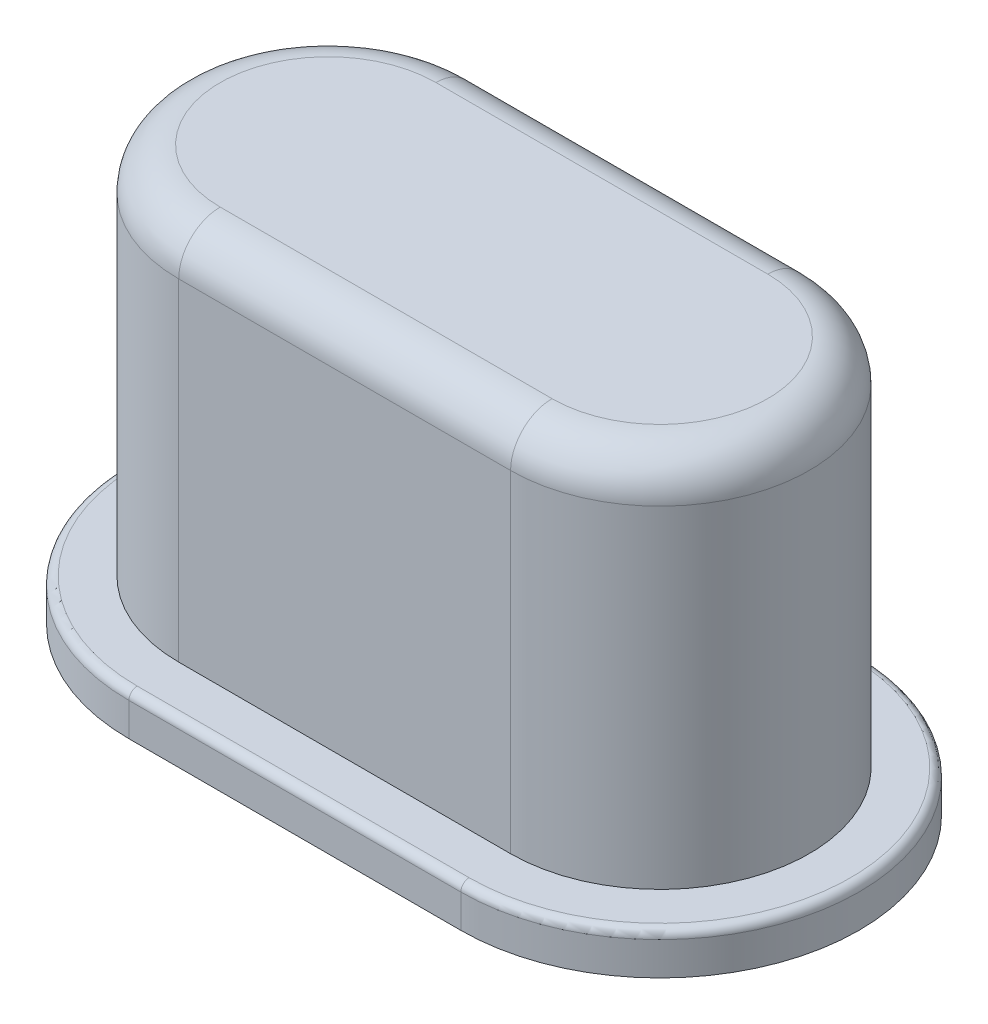
ISO-10303-21;
HEADER;
FILE_DESCRIPTION(('STEP AP214'),'2;1');
FILE_NAME('part.step','',(''),(''),'','','');
FILE_SCHEMA(('AUTOMOTIVE_DESIGN { 1 0 10303 214 1 1 1 1 }'));
ENDSEC;
DATA;
#1=APPLICATION_CONTEXT('core data for automotive mechanical design processes');
#2=APPLICATION_PROTOCOL_DEFINITION('international standard','automotive_design',2000,#1);
#3=PRODUCT_CONTEXT('',#1,'mechanical');
#4=PRODUCT('Part','Part','',(#3));
#5=PRODUCT_RELATED_PRODUCT_CATEGORY('part','',(#4));
#6=PRODUCT_DEFINITION_FORMATION('','',#4);
#7=PRODUCT_DEFINITION_CONTEXT('part definition',#1,'design');
#8=PRODUCT_DEFINITION('design','',#6,#7);
#9=PRODUCT_DEFINITION_SHAPE('','',#8);
#10=(LENGTH_UNIT() NAMED_UNIT(*) SI_UNIT(.MILLI.,.METRE.));
#11=(NAMED_UNIT(*) PLANE_ANGLE_UNIT() SI_UNIT($,.RADIAN.));
#12=(NAMED_UNIT(*) SI_UNIT($,.STERADIAN.) SOLID_ANGLE_UNIT());
#13=UNCERTAINTY_MEASURE_WITH_UNIT(LENGTH_MEASURE(1.E-05),#10,'distance_accuracy_value','');
#14=(GEOMETRIC_REPRESENTATION_CONTEXT(3) GLOBAL_UNCERTAINTY_ASSIGNED_CONTEXT((#13)) GLOBAL_UNIT_ASSIGNED_CONTEXT((#10,
#11,#12)) REPRESENTATION_CONTEXT('',''));
#15=CARTESIAN_POINT('',(0.,0.,0.));
#16=DIRECTION('',(0.,0.,1.));
#17=DIRECTION('',(1.,0.,0.));
#18=AXIS2_PLACEMENT_3D('',#15,#16,#17);
#19=CARTESIAN_POINT('',(-2.,4.5,0.));
#20=DIRECTION('',(0.,-1.,0.));
#21=DIRECTION('',(0.,0.,-1.));
#22=AXIS2_PLACEMENT_3D('',#19,#20,#21);
#23=CYLINDRICAL_SURFACE('',#22,1.8);
#24=DIRECTION('',(0.,-1.,0.));
#25=VECTOR('',#24,1.);
#26=CARTESIAN_POINT('',(-2.,4.5,1.8));
#27=LINE('',#26,#25);
#28=CARTESIAN_POINT('',(-2.,4.,1.8));
#29=VERTEX_POINT('',#28);
#30=CARTESIAN_POINT('',(-2.,0.,1.8));
#31=VERTEX_POINT('',#30);
#32=EDGE_CURVE('E178',#29,#31,#27,.T.);
#33=ORIENTED_EDGE('',*,*,#32,.F.);
#34=CARTESIAN_POINT('',(-2.,4.,0.));
#35=DIRECTION('',(0.,1.,0.));
#36=DIRECTION('',(0.,0.,1.));
#37=AXIS2_PLACEMENT_3D('',#34,#35,#36);
#38=CIRCLE('',#37,1.8);
#39=CARTESIAN_POINT('',(-2.,4.,-1.8));
#40=VERTEX_POINT('',#39);
#41=EDGE_CURVE('E186',#29,#40,#38,.F.);
#42=ORIENTED_EDGE('',*,*,#41,.T.);
#43=DIRECTION('',(0.,-1.,0.));
#44=VECTOR('',#43,1.);
#45=CARTESIAN_POINT('',(-2.,4.5,-1.8));
#46=LINE('',#45,#44);
#47=CARTESIAN_POINT('',(-2.,0.,-1.8));
#48=VERTEX_POINT('',#47);
#49=EDGE_CURVE('E175',#40,#48,#46,.T.);
#50=ORIENTED_EDGE('',*,*,#49,.T.);
#51=CARTESIAN_POINT('',(-2.,0.,0.));
#52=DIRECTION('',(0.,1.,0.));
#53=DIRECTION('',(0.,0.,1.));
#54=AXIS2_PLACEMENT_3D('',#51,#52,#53);
#55=CIRCLE('',#54,1.8);
#56=EDGE_CURVE('E154',#48,#31,#55,.T.);
#57=ORIENTED_EDGE('',*,*,#56,.T.);
#58=EDGE_LOOP('',(#33,#42,#50,#57));
#59=FACE_BOUND('',#58,.T.);
#60=ADVANCED_FACE('F41',(#59),#23,.T.);
#61=CARTESIAN_POINT('',(-2.,4.5,1.8));
#62=DIRECTION('',(0.,0.,-1.));
#63=DIRECTION('',(-1.,0.,0.));
#64=AXIS2_PLACEMENT_3D('',#61,#62,#63);
#65=PLANE('',#64);
#66=DIRECTION('',(0.,-1.,0.));
#67=VECTOR('',#66,1.);
#68=CARTESIAN_POINT('',(2.,4.5,1.8));
#69=LINE('',#68,#67);
#70=CARTESIAN_POINT('',(2.,4.,1.8));
#71=VERTEX_POINT('',#70);
#72=CARTESIAN_POINT('',(2.,0.,1.8));
#73=VERTEX_POINT('',#72);
#74=EDGE_CURVE('E176',#71,#73,#69,.T.);
#75=ORIENTED_EDGE('',*,*,#74,.F.);
#76=DIRECTION('',(1.,0.,0.));
#77=VECTOR('',#76,1.);
#78=CARTESIAN_POINT('',(-2.,4.,1.8));
#79=LINE('',#78,#77);
#80=EDGE_CURVE('E196',#71,#29,#79,.F.);
#81=ORIENTED_EDGE('',*,*,#80,.T.);
#82=ORIENTED_EDGE('',*,*,#32,.T.);
#83=DIRECTION('',(1.,0.,0.));
#84=VECTOR('',#83,1.);
#85=CARTESIAN_POINT('',(-2.,0.,1.8));
#86=LINE('',#85,#84);
#87=EDGE_CURVE('E160',#31,#73,#86,.T.);
#88=ORIENTED_EDGE('',*,*,#87,.T.);
#89=EDGE_LOOP('',(#75,#81,#82,#88));
#90=FACE_BOUND('',#89,.T.);
#91=ADVANCED_FACE('F261',(#90),#65,.F.);
#92=CARTESIAN_POINT('',(2.,4.5,0.));
#93=DIRECTION('',(0.,-1.,0.));
#94=DIRECTION('',(0.,0.,-1.));
#95=AXIS2_PLACEMENT_3D('',#92,#93,#94);
#96=CYLINDRICAL_SURFACE('',#95,1.8);
#97=DIRECTION('',(0.,-1.,0.));
#98=VECTOR('',#97,1.);
#99=CARTESIAN_POINT('',(2.,4.5,-1.8));
#100=LINE('',#99,#98);
#101=CARTESIAN_POINT('',(2.,4.,-1.8));
#102=VERTEX_POINT('',#101);
#103=CARTESIAN_POINT('',(2.,0.,-1.8));
#104=VERTEX_POINT('',#103);
#105=EDGE_CURVE('E172',#102,#104,#100,.T.);
#106=ORIENTED_EDGE('',*,*,#105,.F.);
#107=CARTESIAN_POINT('',(2.,4.,0.));
#108=DIRECTION('',(0.,1.,0.));
#109=DIRECTION('',(0.,0.,1.));
#110=AXIS2_PLACEMENT_3D('',#107,#108,#109);
#111=CIRCLE('',#110,1.8);
#112=EDGE_CURVE('E191',#102,#71,#111,.F.);
#113=ORIENTED_EDGE('',*,*,#112,.T.);
#114=ORIENTED_EDGE('',*,*,#74,.T.);
#115=CARTESIAN_POINT('',(2.,0.,0.));
#116=DIRECTION('',(0.,1.,0.));
#117=DIRECTION('',(0.,0.,-1.));
#118=AXIS2_PLACEMENT_3D('',#115,#116,#117);
#119=CIRCLE('',#118,1.8);
#120=EDGE_CURVE('E168',#73,#104,#119,.T.);
#121=ORIENTED_EDGE('',*,*,#120,.T.);
#122=EDGE_LOOP('',(#106,#113,#114,#121));
#123=FACE_BOUND('',#122,.T.);
#124=ADVANCED_FACE('F269',(#123),#96,.T.);
#125=CARTESIAN_POINT('',(-2.,4.5,-1.8));
#126=DIRECTION('',(0.,0.,1.));
#127=DIRECTION('',(1.,0.,0.));
#128=AXIS2_PLACEMENT_3D('',#125,#126,#127);
#129=PLANE('',#128);
#130=ORIENTED_EDGE('',*,*,#49,.F.);
#131=DIRECTION('',(-1.,0.,0.));
#132=VECTOR('',#131,1.);
#133=CARTESIAN_POINT('',(2.,4.,-1.8));
#134=LINE('',#133,#132);
#135=EDGE_CURVE('E195',#40,#102,#134,.F.);
#136=ORIENTED_EDGE('',*,*,#135,.T.);
#137=ORIENTED_EDGE('',*,*,#105,.T.);
#138=DIRECTION('',(-1.,0.,0.));
#139=VECTOR('',#138,1.);
#140=CARTESIAN_POINT('',(-2.,0.,-1.8));
#141=LINE('',#140,#139);
#142=EDGE_CURVE('E169',#104,#48,#141,.T.);
#143=ORIENTED_EDGE('',*,*,#142,.T.);
#144=EDGE_LOOP('',(#130,#136,#137,#143));
#145=FACE_BOUND('',#144,.T.);
#146=ADVANCED_FACE('F368',(#145),#129,.F.);
#147=CARTESIAN_POINT('',(-2.,4.5,0.));
#148=DIRECTION('',(0.,1.,0.));
#149=DIRECTION('',(0.,0.,1.));
#150=AXIS2_PLACEMENT_3D('',#147,#148,#149);
#151=PLANE('',#150);
#152=DIRECTION('',(-1.,0.,0.));
#153=VECTOR('',#152,1.);
#154=CARTESIAN_POINT('',(-2.,4.5,-1.3));
#155=LINE('',#154,#153);
#156=CARTESIAN_POINT('',(2.,4.5,-1.3));
#157=VERTEX_POINT('',#156);
#158=CARTESIAN_POINT('',(-2.,4.5,-1.3));
#159=VERTEX_POINT('',#158);
#160=EDGE_CURVE('E183',#157,#159,#155,.T.);
#161=ORIENTED_EDGE('',*,*,#160,.T.);
#162=CARTESIAN_POINT('',(-2.,4.5,0.));
#163=DIRECTION('',(0.,1.,0.));
#164=DIRECTION('',(0.,0.,1.));
#165=AXIS2_PLACEMENT_3D('',#162,#163,#164);
#166=CIRCLE('',#165,1.3);
#167=CARTESIAN_POINT('',(-2.,4.5,1.3));
#168=VERTEX_POINT('',#167);
#169=EDGE_CURVE('E187',#159,#168,#166,.T.);
#170=ORIENTED_EDGE('',*,*,#169,.T.);
#171=DIRECTION('',(1.,0.,0.));
#172=VECTOR('',#171,1.);
#173=CARTESIAN_POINT('',(2.,4.5,1.3));
#174=LINE('',#173,#172);
#175=CARTESIAN_POINT('',(2.,4.5,1.3));
#176=VERTEX_POINT('',#175);
#177=EDGE_CURVE('E179',#168,#176,#174,.T.);
#178=ORIENTED_EDGE('',*,*,#177,.T.);
#179=CARTESIAN_POINT('',(2.,4.5,0.));
#180=DIRECTION('',(0.,1.,0.));
#181=DIRECTION('',(0.,0.,1.));
#182=AXIS2_PLACEMENT_3D('',#179,#180,#181);
#183=CIRCLE('',#182,1.3);
#184=EDGE_CURVE('E185',#176,#157,#183,.T.);
#185=ORIENTED_EDGE('',*,*,#184,.T.);
#186=EDGE_LOOP('',(#161,#170,#178,#185));
#187=FACE_BOUND('',#186,.T.);
#188=ADVANCED_FACE('F338',(#187),#151,.T.);
#189=CARTESIAN_POINT('',(0.,-0.5,-2.4));
#190=DIRECTION('',(0.,0.,1.));
#191=DIRECTION('',(1.,0.,0.));
#192=AXIS2_PLACEMENT_3D('',#189,#190,#191);
#193=PLANE('',#192);
#194=DIRECTION('',(0.,1.,0.));
#195=VECTOR('',#194,1.);
#196=CARTESIAN_POINT('',(-2.,-0.5,-2.4));
#197=LINE('',#196,#195);
#198=CARTESIAN_POINT('',(-2.,-0.5,-2.4));
#199=VERTEX_POINT('',#198);
#200=CARTESIAN_POINT('',(-2.,-0.1,-2.4));
#201=VERTEX_POINT('',#200);
#202=EDGE_CURVE('E246',#199,#201,#197,.T.);
#203=ORIENTED_EDGE('',*,*,#202,.T.);
#204=DIRECTION('',(1.,0.,0.));
#205=VECTOR('',#204,1.);
#206=CARTESIAN_POINT('',(0.,-0.1,-2.4));
#207=LINE('',#206,#205);
#208=CARTESIAN_POINT('',(2.,-0.1,-2.4));
#209=VERTEX_POINT('',#208);
#210=EDGE_CURVE('E153',#201,#209,#207,.T.);
#211=ORIENTED_EDGE('',*,*,#210,.T.);
#212=DIRECTION('',(0.,1.,0.));
#213=VECTOR('',#212,1.);
#214=CARTESIAN_POINT('',(2.,-0.5,-2.4));
#215=LINE('',#214,#213);
#216=CARTESIAN_POINT('',(2.,-0.5,-2.4));
#217=VERTEX_POINT('',#216);
#218=EDGE_CURVE('E139',#217,#209,#215,.T.);
#219=ORIENTED_EDGE('',*,*,#218,.F.);
#220=DIRECTION('',(1.,0.,0.));
#221=VECTOR('',#220,1.);
#222=CARTESIAN_POINT('',(0.,-0.5,-2.4));
#223=LINE('',#222,#221);
#224=EDGE_CURVE('E141',#199,#217,#223,.T.);
#225=ORIENTED_EDGE('',*,*,#224,.F.);
#226=EDGE_LOOP('',(#203,#211,#219,#225));
#227=FACE_BOUND('',#226,.T.);
#228=ADVANCED_FACE('F155',(#227),#193,.F.);
#229=CARTESIAN_POINT('',(2.,-0.5,0.));
#230=DIRECTION('',(0.,1.,0.));
#231=DIRECTION('',(0.,0.,1.));
#232=AXIS2_PLACEMENT_3D('',#229,#230,#231);
#233=CYLINDRICAL_SURFACE('',#232,2.4);
#234=ORIENTED_EDGE('',*,*,#218,.T.);
#235=CARTESIAN_POINT('',(2.,-0.1,0.));
#236=DIRECTION('',(0.,-1.,0.));
#237=DIRECTION('',(0.,0.,-1.));
#238=AXIS2_PLACEMENT_3D('',#235,#236,#237);
#239=CIRCLE('',#238,2.4);
#240=CARTESIAN_POINT('',(2.,-0.1,2.4));
#241=VERTEX_POINT('',#240);
#242=EDGE_CURVE('E197',#209,#241,#239,.T.);
#243=ORIENTED_EDGE('',*,*,#242,.T.);
#244=DIRECTION('',(0.,1.,0.));
#245=VECTOR('',#244,1.);
#246=CARTESIAN_POINT('',(2.,-0.5,2.4));
#247=LINE('',#246,#245);
#248=CARTESIAN_POINT('',(2.,-0.5,2.4));
#249=VERTEX_POINT('',#248);
#250=EDGE_CURVE('E136',#249,#241,#247,.T.);
#251=ORIENTED_EDGE('',*,*,#250,.F.);
#252=CARTESIAN_POINT('',(2.,-0.5,0.));
#253=DIRECTION('',(0.,-1.,0.));
#254=DIRECTION('',(0.,0.,-1.));
#255=AXIS2_PLACEMENT_3D('',#252,#253,#254);
#256=CIRCLE('',#255,2.4);
#257=EDGE_CURVE('E135',#217,#249,#256,.T.);
#258=ORIENTED_EDGE('',*,*,#257,.F.);
#259=EDGE_LOOP('',(#234,#243,#251,#258));
#260=FACE_BOUND('',#259,.T.);
#261=ADVANCED_FACE('F133',(#260),#233,.T.);
#262=CARTESIAN_POINT('',(0.,-0.5,2.4));
#263=DIRECTION('',(0.,0.,-1.));
#264=DIRECTION('',(-1.,0.,0.));
#265=AXIS2_PLACEMENT_3D('',#262,#263,#264);
#266=PLANE('',#265);
#267=ORIENTED_EDGE('',*,*,#250,.T.);
#268=DIRECTION('',(-1.,0.,0.));
#269=VECTOR('',#268,1.);
#270=CARTESIAN_POINT('',(0.,-0.1,2.4));
#271=LINE('',#270,#269);
#272=CARTESIAN_POINT('',(-2.,-0.1,2.4));
#273=VERTEX_POINT('',#272);
#274=EDGE_CURVE('E11',#241,#273,#271,.T.);
#275=ORIENTED_EDGE('',*,*,#274,.T.);
#276=DIRECTION('',(0.,1.,0.));
#277=VECTOR('',#276,1.);
#278=CARTESIAN_POINT('',(-2.,-0.5,2.4));
#279=LINE('',#278,#277);
#280=CARTESIAN_POINT('',(-2.,-0.5,2.4));
#281=VERTEX_POINT('',#280);
#282=EDGE_CURVE('E158',#281,#273,#279,.T.);
#283=ORIENTED_EDGE('',*,*,#282,.F.);
#284=DIRECTION('',(-1.,0.,0.));
#285=VECTOR('',#284,1.);
#286=CARTESIAN_POINT('',(0.,-0.5,2.4));
#287=LINE('',#286,#285);
#288=EDGE_CURVE('E145',#249,#281,#287,.T.);
#289=ORIENTED_EDGE('',*,*,#288,.F.);
#290=EDGE_LOOP('',(#267,#275,#283,#289));
#291=FACE_BOUND('',#290,.T.);
#292=ADVANCED_FACE('F242',(#291),#266,.F.);
#293=CARTESIAN_POINT('',(-2.,-0.5,0.));
#294=DIRECTION('',(0.,1.,0.));
#295=DIRECTION('',(0.,0.,1.));
#296=AXIS2_PLACEMENT_3D('',#293,#294,#295);
#297=CYLINDRICAL_SURFACE('',#296,2.4);
#298=ORIENTED_EDGE('',*,*,#282,.T.);
#299=CARTESIAN_POINT('',(-2.,-0.1,0.));
#300=DIRECTION('',(0.,-1.,0.));
#301=DIRECTION('',(0.,0.,-1.));
#302=AXIS2_PLACEMENT_3D('',#299,#300,#301);
#303=CIRCLE('',#302,2.4);
#304=EDGE_CURVE('E49',#273,#201,#303,.T.);
#305=ORIENTED_EDGE('',*,*,#304,.T.);
#306=ORIENTED_EDGE('',*,*,#202,.F.);
#307=CARTESIAN_POINT('',(-2.,-0.5,0.));
#308=DIRECTION('',(0.,-1.,0.));
#309=DIRECTION('',(0.,0.,-1.));
#310=AXIS2_PLACEMENT_3D('',#307,#308,#309);
#311=CIRCLE('',#310,2.4);
#312=EDGE_CURVE('E149',#281,#199,#311,.T.);
#313=ORIENTED_EDGE('',*,*,#312,.F.);
#314=EDGE_LOOP('',(#298,#305,#306,#313));
#315=FACE_BOUND('',#314,.T.);
#316=ADVANCED_FACE('F248',(#315),#297,.T.);
#317=CARTESIAN_POINT('',(0.,-0.5,0.));
#318=DIRECTION('',(0.,-1.,0.));
#319=DIRECTION('',(0.,0.,-1.));
#320=AXIS2_PLACEMENT_3D('',#317,#318,#319);
#321=PLANE('',#320);
#322=ORIENTED_EDGE('',*,*,#224,.T.);
#323=ORIENTED_EDGE('',*,*,#257,.T.);
#324=ORIENTED_EDGE('',*,*,#288,.T.);
#325=ORIENTED_EDGE('',*,*,#312,.T.);
#326=EDGE_LOOP('',(#322,#323,#324,#325));
#327=FACE_BOUND('',#326,.T.);
#328=ADVANCED_FACE('F147',(#327),#321,.T.);
#329=CARTESIAN_POINT('',(0.,0.,0.));
#330=DIRECTION('',(0.,-1.,0.));
#331=DIRECTION('',(0.,0.,-1.));
#332=AXIS2_PLACEMENT_3D('',#329,#330,#331);
#333=PLANE('',#332);
#334=DIRECTION('',(-1.,0.,0.));
#335=VECTOR('',#334,1.);
#336=CARTESIAN_POINT('',(0.,0.,2.3));
#337=LINE('',#336,#335);
#338=CARTESIAN_POINT('',(-2.,0.,2.3));
#339=VERTEX_POINT('',#338);
#340=CARTESIAN_POINT('',(2.,0.,2.3));
#341=VERTEX_POINT('',#340);
#342=EDGE_CURVE('E209',#339,#341,#337,.F.);
#343=ORIENTED_EDGE('',*,*,#342,.T.);
#344=CARTESIAN_POINT('',(2.,0.,0.));
#345=DIRECTION('',(0.,-1.,0.));
#346=DIRECTION('',(0.,0.,-1.));
#347=AXIS2_PLACEMENT_3D('',#344,#345,#346);
#348=CIRCLE('',#347,2.3);
#349=CARTESIAN_POINT('',(2.,0.,-2.3));
#350=VERTEX_POINT('',#349);
#351=EDGE_CURVE('E213',#341,#350,#348,.F.);
#352=ORIENTED_EDGE('',*,*,#351,.T.);
#353=DIRECTION('',(1.,0.,0.));
#354=VECTOR('',#353,1.);
#355=CARTESIAN_POINT('',(0.,0.,-2.3));
#356=LINE('',#355,#354);
#357=CARTESIAN_POINT('',(-2.,0.,-2.3));
#358=VERTEX_POINT('',#357);
#359=EDGE_CURVE('E214',#350,#358,#356,.F.);
#360=ORIENTED_EDGE('',*,*,#359,.T.);
#361=CARTESIAN_POINT('',(-2.,0.,0.));
#362=DIRECTION('',(0.,-1.,0.));
#363=DIRECTION('',(0.,0.,-1.));
#364=AXIS2_PLACEMENT_3D('',#361,#362,#363);
#365=CIRCLE('',#364,2.3);
#366=EDGE_CURVE('E212',#358,#339,#365,.F.);
#367=ORIENTED_EDGE('',*,*,#366,.T.);
#368=EDGE_LOOP('',(#343,#352,#360,#367));
#369=FACE_BOUND('',#368,.T.);
#370=ORIENTED_EDGE('',*,*,#56,.F.);
#371=ORIENTED_EDGE('',*,*,#142,.F.);
#372=ORIENTED_EDGE('',*,*,#120,.F.);
#373=ORIENTED_EDGE('',*,*,#87,.F.);
#374=EDGE_LOOP('',(#370,#371,#372,#373));
#375=FACE_BOUND('',#374,.T.);
#376=ADVANCED_FACE('F236',(#369,#375),#333,.F.);
#377=CARTESIAN_POINT('',(2.,4.,0.));
#378=DIRECTION('',(0.,1.,0.));
#379=DIRECTION('',(0.,0.,1.));
#380=AXIS2_PLACEMENT_3D('',#377,#378,#379);
#381=TOROIDAL_SURFACE('',#380,1.3,0.5);
#382=CARTESIAN_POINT('',(2.,4.,1.3));
#383=DIRECTION('',(-1.,0.,0.));
#384=DIRECTION('',(0.,0.,1.));
#385=AXIS2_PLACEMENT_3D('',#382,#383,#384);
#386=CIRCLE('',#385,0.5);
#387=EDGE_CURVE('E205',#71,#176,#386,.T.);
#388=ORIENTED_EDGE('',*,*,#387,.F.);
#389=ORIENTED_EDGE('',*,*,#112,.F.);
#390=CARTESIAN_POINT('',(2.,4.,-1.3));
#391=DIRECTION('',(-1.,0.,0.));
#392=DIRECTION('',(0.,0.,1.));
#393=AXIS2_PLACEMENT_3D('',#390,#391,#392);
#394=CIRCLE('',#393,0.5);
#395=EDGE_CURVE('E148',#157,#102,#394,.T.);
#396=ORIENTED_EDGE('',*,*,#395,.F.);
#397=ORIENTED_EDGE('',*,*,#184,.F.);
#398=EDGE_LOOP('',(#388,#389,#396,#397));
#399=FACE_BOUND('',#398,.T.);
#400=ADVANCED_FACE('F283',(#399),#381,.T.);
#401=CARTESIAN_POINT('',(-2.,4.,-1.3));
#402=DIRECTION('',(1.,0.,0.));
#403=DIRECTION('',(0.,0.,-1.));
#404=AXIS2_PLACEMENT_3D('',#401,#402,#403);
#405=CYLINDRICAL_SURFACE('',#404,0.5);
#406=ORIENTED_EDGE('',*,*,#395,.T.);
#407=ORIENTED_EDGE('',*,*,#135,.F.);
#408=CARTESIAN_POINT('',(-2.,4.,-1.3));
#409=DIRECTION('',(-1.,0.,0.));
#410=DIRECTION('',(0.,0.,1.));
#411=AXIS2_PLACEMENT_3D('',#408,#409,#410);
#412=CIRCLE('',#411,0.5);
#413=EDGE_CURVE('E202',#159,#40,#412,.T.);
#414=ORIENTED_EDGE('',*,*,#413,.F.);
#415=ORIENTED_EDGE('',*,*,#160,.F.);
#416=EDGE_LOOP('',(#406,#407,#414,#415));
#417=FACE_BOUND('',#416,.T.);
#418=ADVANCED_FACE('F278',(#417),#405,.T.);
#419=CARTESIAN_POINT('',(-2.,4.,1.3));
#420=DIRECTION('',(-1.,0.,0.));
#421=DIRECTION('',(0.,0.,1.));
#422=AXIS2_PLACEMENT_3D('',#419,#420,#421);
#423=CYLINDRICAL_SURFACE('',#422,0.5);
#424=ORIENTED_EDGE('',*,*,#387,.T.);
#425=ORIENTED_EDGE('',*,*,#177,.F.);
#426=CARTESIAN_POINT('',(-2.,4.,1.3));
#427=DIRECTION('',(-1.,0.,0.));
#428=DIRECTION('',(0.,0.,1.));
#429=AXIS2_PLACEMENT_3D('',#426,#427,#428);
#430=CIRCLE('',#429,0.5);
#431=EDGE_CURVE('E198',#29,#168,#430,.T.);
#432=ORIENTED_EDGE('',*,*,#431,.F.);
#433=ORIENTED_EDGE('',*,*,#80,.F.);
#434=EDGE_LOOP('',(#424,#425,#432,#433));
#435=FACE_BOUND('',#434,.T.);
#436=ADVANCED_FACE('F277',(#435),#423,.T.);
#437=CARTESIAN_POINT('',(-2.,4.,0.));
#438=DIRECTION('',(0.,1.,0.));
#439=DIRECTION('',(0.,0.,1.));
#440=AXIS2_PLACEMENT_3D('',#437,#438,#439);
#441=TOROIDAL_SURFACE('',#440,1.3,0.5);
#442=ORIENTED_EDGE('',*,*,#413,.T.);
#443=ORIENTED_EDGE('',*,*,#41,.F.);
#444=ORIENTED_EDGE('',*,*,#431,.T.);
#445=ORIENTED_EDGE('',*,*,#169,.F.);
#446=EDGE_LOOP('',(#442,#443,#444,#445));
#447=FACE_BOUND('',#446,.T.);
#448=ADVANCED_FACE('F271',(#447),#441,.T.);
#449=CARTESIAN_POINT('',(-2.,-0.1,0.));
#450=DIRECTION('',(0.,-1.,0.));
#451=DIRECTION('',(0.,0.,-1.));
#452=AXIS2_PLACEMENT_3D('',#449,#450,#451);
#453=TOROIDAL_SURFACE('',#452,2.3,0.1);
#454=CARTESIAN_POINT('',(-2.,-0.1,2.3));
#455=DIRECTION('',(1.,0.,0.));
#456=DIRECTION('',(0.,0.,-1.));
#457=AXIS2_PLACEMENT_3D('',#454,#455,#456);
#458=CIRCLE('',#457,0.1);
#459=EDGE_CURVE('E225',#339,#273,#458,.T.);
#460=ORIENTED_EDGE('',*,*,#459,.F.);
#461=ORIENTED_EDGE('',*,*,#366,.F.);
#462=CARTESIAN_POINT('',(-2.,-0.1,-2.3));
#463=DIRECTION('',(1.,0.,0.));
#464=DIRECTION('',(0.,0.,-1.));
#465=AXIS2_PLACEMENT_3D('',#462,#463,#464);
#466=CIRCLE('',#465,0.1);
#467=EDGE_CURVE('E44',#201,#358,#466,.T.);
#468=ORIENTED_EDGE('',*,*,#467,.F.);
#469=ORIENTED_EDGE('',*,*,#304,.F.);
#470=EDGE_LOOP('',(#460,#461,#468,#469));
#471=FACE_BOUND('',#470,.T.);
#472=ADVANCED_FACE('F43',(#471),#453,.T.);
#473=CARTESIAN_POINT('',(0.,-0.1,-2.3));
#474=DIRECTION('',(1.,0.,0.));
#475=DIRECTION('',(0.,0.,-1.));
#476=AXIS2_PLACEMENT_3D('',#473,#474,#475);
#477=CYLINDRICAL_SURFACE('',#476,0.1);
#478=ORIENTED_EDGE('',*,*,#467,.T.);
#479=ORIENTED_EDGE('',*,*,#359,.F.);
#480=CARTESIAN_POINT('',(2.,-0.1,-2.3));
#481=DIRECTION('',(1.,0.,0.));
#482=DIRECTION('',(0.,0.,-1.));
#483=AXIS2_PLACEMENT_3D('',#480,#481,#482);
#484=CIRCLE('',#483,0.1);
#485=EDGE_CURVE('E224',#209,#350,#484,.T.);
#486=ORIENTED_EDGE('',*,*,#485,.F.);
#487=ORIENTED_EDGE('',*,*,#210,.F.);
#488=EDGE_LOOP('',(#478,#479,#486,#487));
#489=FACE_BOUND('',#488,.T.);
#490=ADVANCED_FACE('F235',(#489),#477,.T.);
#491=CARTESIAN_POINT('',(0.,-0.1,2.3));
#492=DIRECTION('',(-1.,0.,0.));
#493=DIRECTION('',(0.,0.,1.));
#494=AXIS2_PLACEMENT_3D('',#491,#492,#493);
#495=CYLINDRICAL_SURFACE('',#494,0.1);
#496=ORIENTED_EDGE('',*,*,#459,.T.);
#497=ORIENTED_EDGE('',*,*,#274,.F.);
#498=CARTESIAN_POINT('',(2.,-0.1,2.3));
#499=DIRECTION('',(1.,0.,0.));
#500=DIRECTION('',(0.,0.,-1.));
#501=AXIS2_PLACEMENT_3D('',#498,#499,#500);
#502=CIRCLE('',#501,0.1);
#503=EDGE_CURVE('E219',#341,#241,#502,.T.);
#504=ORIENTED_EDGE('',*,*,#503,.F.);
#505=ORIENTED_EDGE('',*,*,#342,.F.);
#506=EDGE_LOOP('',(#496,#497,#504,#505));
#507=FACE_BOUND('',#506,.T.);
#508=ADVANCED_FACE('F243',(#507),#495,.T.);
#509=CARTESIAN_POINT('',(2.,-0.1,0.));
#510=DIRECTION('',(0.,-1.,0.));
#511=DIRECTION('',(0.,0.,-1.));
#512=AXIS2_PLACEMENT_3D('',#509,#510,#511);
#513=TOROIDAL_SURFACE('',#512,2.3,0.1);
#514=ORIENTED_EDGE('',*,*,#485,.T.);
#515=ORIENTED_EDGE('',*,*,#351,.F.);
#516=ORIENTED_EDGE('',*,*,#503,.T.);
#517=ORIENTED_EDGE('',*,*,#242,.F.);
#518=EDGE_LOOP('',(#514,#515,#516,#517));
#519=FACE_BOUND('',#518,.T.);
#520=ADVANCED_FACE('F241',(#519),#513,.T.);
#521=CLOSED_SHELL('',(#60,#91,#124,#146,#188,#228,#261,#292,#316,#328,#376,#400,#418,#436,#448,
#472,#490,#508,#520));
#522=MANIFOLD_SOLID_BREP('B2',#521);
#523=ADVANCED_BREP_SHAPE_REPRESENTATION('',(#18,#522),#14);
#524=SHAPE_DEFINITION_REPRESENTATION(#9,#523);
ENDSEC;
END-ISO-10303-21;
